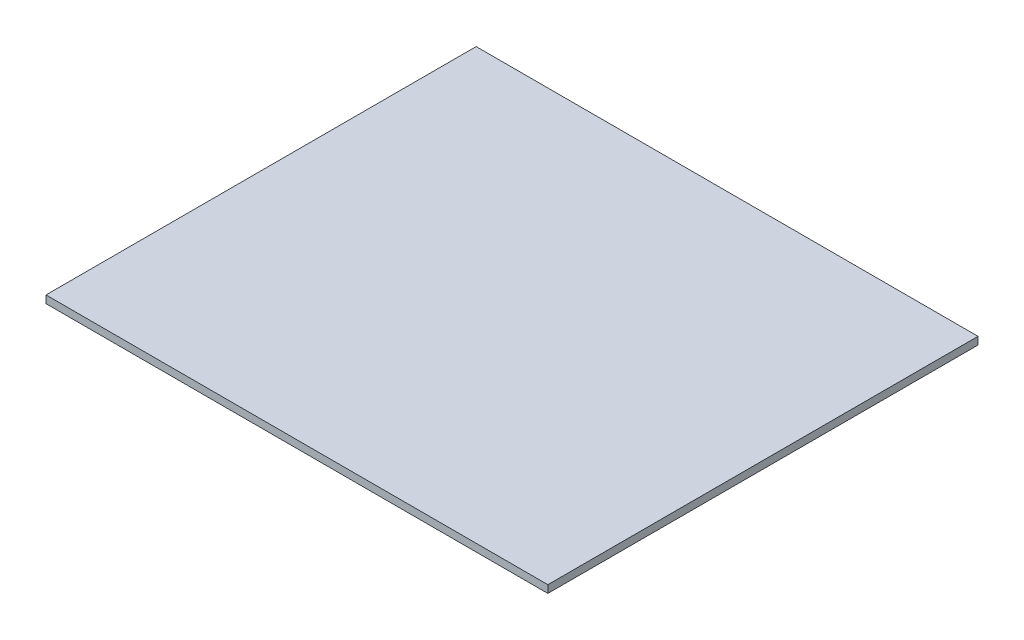
ISO-10303-21;
HEADER;
FILE_DESCRIPTION(('STEP AP214'),'2;1');
FILE_NAME('part.step','',(''),(''),'','','');
FILE_SCHEMA(('AUTOMOTIVE_DESIGN { 1 0 10303 214 1 1 1 1 }'));
ENDSEC;
DATA;
#1=APPLICATION_CONTEXT('core data for automotive mechanical design processes');
#2=APPLICATION_PROTOCOL_DEFINITION('international standard','automotive_design',2000,#1);
#3=PRODUCT_CONTEXT('',#1,'mechanical');
#4=PRODUCT('Part','Part','',(#3));
#5=PRODUCT_RELATED_PRODUCT_CATEGORY('part','',(#4));
#6=PRODUCT_DEFINITION_FORMATION('','',#4);
#7=PRODUCT_DEFINITION_CONTEXT('part definition',#1,'design');
#8=PRODUCT_DEFINITION('design','',#6,#7);
#9=PRODUCT_DEFINITION_SHAPE('','',#8);
#10=(LENGTH_UNIT() NAMED_UNIT(*) SI_UNIT(.MILLI.,.METRE.));
#11=(NAMED_UNIT(*) PLANE_ANGLE_UNIT() SI_UNIT($,.RADIAN.));
#12=(NAMED_UNIT(*) SI_UNIT($,.STERADIAN.) SOLID_ANGLE_UNIT());
#13=UNCERTAINTY_MEASURE_WITH_UNIT(LENGTH_MEASURE(1.E-05),#10,'distance_accuracy_value','');
#14=(GEOMETRIC_REPRESENTATION_CONTEXT(3) GLOBAL_UNCERTAINTY_ASSIGNED_CONTEXT((#13)) GLOBAL_UNIT_ASSIGNED_CONTEXT((#10,
#11,#12)) REPRESENTATION_CONTEXT('',''));
#15=CARTESIAN_POINT('',(0.,0.,0.));
#16=DIRECTION('',(0.,0.,1.));
#17=DIRECTION('',(1.,0.,0.));
#18=AXIS2_PLACEMENT_3D('',#15,#16,#17);
#19=CARTESIAN_POINT('',(0.,3.175,0.));
#20=DIRECTION('',(1.,0.,0.));
#21=DIRECTION('',(0.,0.,-1.));
#22=AXIS2_PLACEMENT_3D('',#19,#20,#21);
#23=PLANE('',#22);
#24=DIRECTION('',(0.,0.,1.));
#25=VECTOR('',#24,1.);
#26=CARTESIAN_POINT('',(0.,0.,0.));
#27=LINE('',#26,#25);
#28=CARTESIAN_POINT('',(0.,0.,-180.));
#29=VERTEX_POINT('',#28);
#30=CARTESIAN_POINT('',(0.,0.,0.));
#31=VERTEX_POINT('',#30);
#32=EDGE_CURVE('E96',#29,#31,#27,.T.);
#33=ORIENTED_EDGE('',*,*,#32,.T.);
#34=DIRECTION('',(0.,-1.,0.));
#35=VECTOR('',#34,1.);
#36=CARTESIAN_POINT('',(0.,3.175,0.));
#37=LINE('',#36,#35);
#38=CARTESIAN_POINT('',(0.,3.175,0.));
#39=VERTEX_POINT('',#38);
#40=EDGE_CURVE('E11',#39,#31,#37,.T.);
#41=ORIENTED_EDGE('',*,*,#40,.F.);
#42=DIRECTION('',(0.,0.,1.));
#43=VECTOR('',#42,1.);
#44=CARTESIAN_POINT('',(0.,3.175,0.));
#45=LINE('',#44,#43);
#46=CARTESIAN_POINT('',(0.,3.175,-180.));
#47=VERTEX_POINT('',#46);
#48=EDGE_CURVE('E84',#47,#39,#45,.T.);
#49=ORIENTED_EDGE('',*,*,#48,.F.);
#50=DIRECTION('',(0.,-1.,0.));
#51=VECTOR('',#50,1.);
#52=CARTESIAN_POINT('',(0.,3.175,-180.));
#53=LINE('',#52,#51);
#54=EDGE_CURVE('E92',#47,#29,#53,.T.);
#55=ORIENTED_EDGE('',*,*,#54,.T.);
#56=EDGE_LOOP('',(#33,#41,#49,#55));
#57=FACE_BOUND('',#56,.T.);
#58=ADVANCED_FACE('F33',(#57),#23,.F.);
#59=CARTESIAN_POINT('',(0.,3.175,0.));
#60=DIRECTION('',(0.,0.,-1.));
#61=DIRECTION('',(-1.,0.,0.));
#62=AXIS2_PLACEMENT_3D('',#59,#60,#61);
#63=PLANE('',#62);
#64=DIRECTION('',(1.,0.,0.));
#65=VECTOR('',#64,1.);
#66=CARTESIAN_POINT('',(0.,0.,0.));
#67=LINE('',#66,#65);
#68=CARTESIAN_POINT('',(210.,0.,0.));
#69=VERTEX_POINT('',#68);
#70=EDGE_CURVE('E88',#31,#69,#67,.T.);
#71=ORIENTED_EDGE('',*,*,#70,.T.);
#72=DIRECTION('',(0.,-1.,0.));
#73=VECTOR('',#72,1.);
#74=CARTESIAN_POINT('',(210.,3.175,0.));
#75=LINE('',#74,#73);
#76=CARTESIAN_POINT('',(210.,3.175,0.));
#77=VERTEX_POINT('',#76);
#78=EDGE_CURVE('E41',#77,#69,#75,.T.);
#79=ORIENTED_EDGE('',*,*,#78,.F.);
#80=DIRECTION('',(1.,0.,0.));
#81=VECTOR('',#80,1.);
#82=CARTESIAN_POINT('',(0.,3.175,0.));
#83=LINE('',#82,#81);
#84=EDGE_CURVE('E79',#39,#77,#83,.T.);
#85=ORIENTED_EDGE('',*,*,#84,.F.);
#86=ORIENTED_EDGE('',*,*,#40,.T.);
#87=EDGE_LOOP('',(#71,#79,#85,#86));
#88=FACE_BOUND('',#87,.T.);
#89=ADVANCED_FACE('F87',(#88),#63,.F.);
#90=CARTESIAN_POINT('',(210.,3.175,0.));
#91=DIRECTION('',(-1.,0.,0.));
#92=DIRECTION('',(0.,0.,1.));
#93=AXIS2_PLACEMENT_3D('',#90,#91,#92);
#94=PLANE('',#93);
#95=DIRECTION('',(0.,0.,-1.));
#96=VECTOR('',#95,1.);
#97=CARTESIAN_POINT('',(210.,0.,0.));
#98=LINE('',#97,#96);
#99=CARTESIAN_POINT('',(210.,0.,-180.));
#100=VERTEX_POINT('',#99);
#101=EDGE_CURVE('E66',#69,#100,#98,.T.);
#102=ORIENTED_EDGE('',*,*,#101,.T.);
#103=DIRECTION('',(0.,-1.,0.));
#104=VECTOR('',#103,1.);
#105=CARTESIAN_POINT('',(210.,3.175,-180.));
#106=LINE('',#105,#104);
#107=CARTESIAN_POINT('',(210.,3.175,-180.));
#108=VERTEX_POINT('',#107);
#109=EDGE_CURVE('E89',#108,#100,#106,.T.);
#110=ORIENTED_EDGE('',*,*,#109,.F.);
#111=DIRECTION('',(0.,0.,-1.));
#112=VECTOR('',#111,1.);
#113=CARTESIAN_POINT('',(210.,3.175,0.));
#114=LINE('',#113,#112);
#115=EDGE_CURVE('E82',#77,#108,#114,.T.);
#116=ORIENTED_EDGE('',*,*,#115,.F.);
#117=ORIENTED_EDGE('',*,*,#78,.T.);
#118=EDGE_LOOP('',(#102,#110,#116,#117));
#119=FACE_BOUND('',#118,.T.);
#120=ADVANCED_FACE('F90',(#119),#94,.F.);
#121=CARTESIAN_POINT('',(0.,3.175,-180.));
#122=DIRECTION('',(0.,0.,1.));
#123=DIRECTION('',(1.,0.,0.));
#124=AXIS2_PLACEMENT_3D('',#121,#122,#123);
#125=PLANE('',#124);
#126=DIRECTION('',(-1.,0.,0.));
#127=VECTOR('',#126,1.);
#128=CARTESIAN_POINT('',(0.,0.,-180.));
#129=LINE('',#128,#127);
#130=EDGE_CURVE('E72',#100,#29,#129,.T.);
#131=ORIENTED_EDGE('',*,*,#130,.T.);
#132=ORIENTED_EDGE('',*,*,#54,.F.);
#133=DIRECTION('',(-1.,0.,0.));
#134=VECTOR('',#133,1.);
#135=CARTESIAN_POINT('',(0.,3.175,-180.));
#136=LINE('',#135,#134);
#137=EDGE_CURVE('E49',#108,#47,#136,.T.);
#138=ORIENTED_EDGE('',*,*,#137,.F.);
#139=ORIENTED_EDGE('',*,*,#109,.T.);
#140=EDGE_LOOP('',(#131,#132,#138,#139));
#141=FACE_BOUND('',#140,.T.);
#142=ADVANCED_FACE('F103',(#141),#125,.F.);
#143=CARTESIAN_POINT('',(0.,3.175,0.));
#144=DIRECTION('',(0.,-1.,0.));
#145=DIRECTION('',(0.,0.,-1.));
#146=AXIS2_PLACEMENT_3D('',#143,#144,#145);
#147=PLANE('',#146);
#148=ORIENTED_EDGE('',*,*,#48,.T.);
#149=ORIENTED_EDGE('',*,*,#84,.T.);
#150=ORIENTED_EDGE('',*,*,#115,.T.);
#151=ORIENTED_EDGE('',*,*,#137,.T.);
#152=EDGE_LOOP('',(#148,#149,#150,#151));
#153=FACE_BOUND('',#152,.T.);
#154=ADVANCED_FACE('F80',(#153),#147,.F.);
#155=CARTESIAN_POINT('',(0.,0.,0.));
#156=DIRECTION('',(0.,-1.,0.));
#157=DIRECTION('',(0.,0.,-1.));
#158=AXIS2_PLACEMENT_3D('',#155,#156,#157);
#159=PLANE('',#158);
#160=ORIENTED_EDGE('',*,*,#32,.F.);
#161=ORIENTED_EDGE('',*,*,#130,.F.);
#162=ORIENTED_EDGE('',*,*,#101,.F.);
#163=ORIENTED_EDGE('',*,*,#70,.F.);
#164=EDGE_LOOP('',(#160,#161,#162,#163));
#165=FACE_BOUND('',#164,.T.);
#166=ADVANCED_FACE('F106',(#165),#159,.T.);
#167=CLOSED_SHELL('',(#58,#89,#120,#142,#154,#166));
#168=MANIFOLD_SOLID_BREP('B2',#167);
#169=ADVANCED_BREP_SHAPE_REPRESENTATION('',(#18,#168),#14);
#170=SHAPE_DEFINITION_REPRESENTATION(#9,#169);
ENDSEC;
END-ISO-10303-21;
